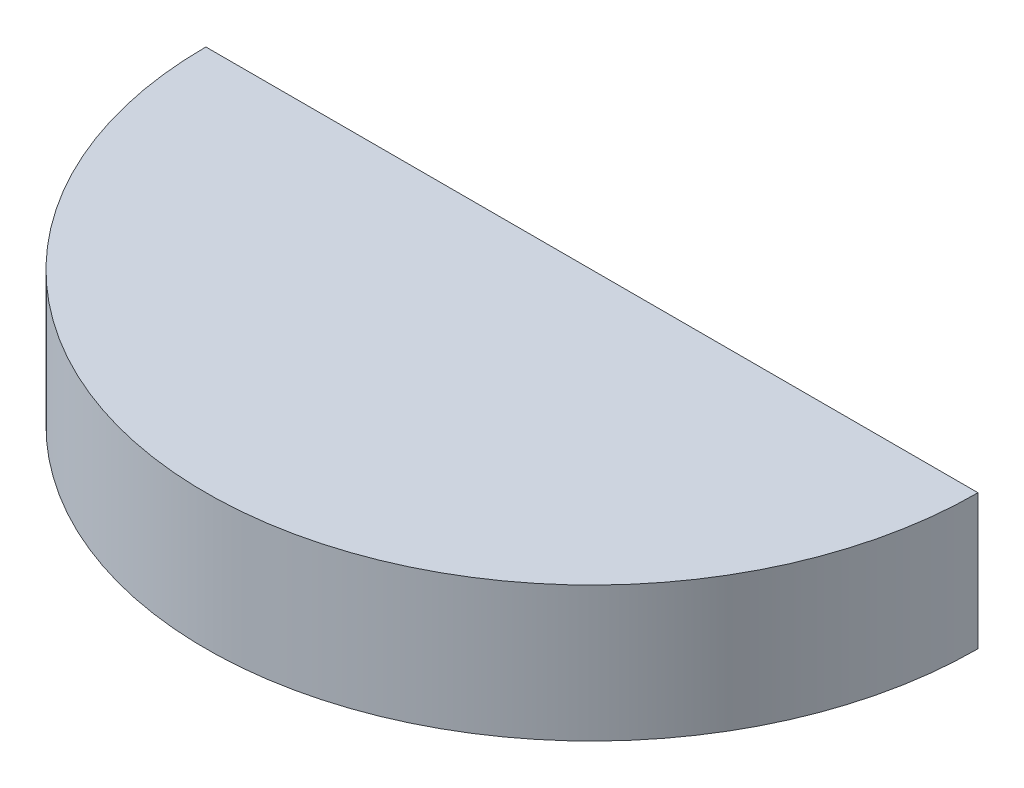
ISO-10303-21;
HEADER;
FILE_DESCRIPTION(('STEP AP214'),'2;1');
FILE_NAME('part.step','',(''),(''),'','','');
FILE_SCHEMA(('AUTOMOTIVE_DESIGN { 1 0 10303 214 1 1 1 1 }'));
ENDSEC;
DATA;
#1=APPLICATION_CONTEXT('core data for automotive mechanical design processes');
#2=APPLICATION_PROTOCOL_DEFINITION('international standard','automotive_design',2000,#1);
#3=PRODUCT_CONTEXT('',#1,'mechanical');
#4=PRODUCT('Part','Part','',(#3));
#5=PRODUCT_RELATED_PRODUCT_CATEGORY('part','',(#4));
#6=PRODUCT_DEFINITION_FORMATION('','',#4);
#7=PRODUCT_DEFINITION_CONTEXT('part definition',#1,'design');
#8=PRODUCT_DEFINITION('design','',#6,#7);
#9=PRODUCT_DEFINITION_SHAPE('','',#8);
#10=(LENGTH_UNIT() NAMED_UNIT(*) SI_UNIT(.MILLI.,.METRE.));
#11=(NAMED_UNIT(*) PLANE_ANGLE_UNIT() SI_UNIT($,.RADIAN.));
#12=(NAMED_UNIT(*) SI_UNIT($,.STERADIAN.) SOLID_ANGLE_UNIT());
#13=UNCERTAINTY_MEASURE_WITH_UNIT(LENGTH_MEASURE(1.E-05),#10,'distance_accuracy_value','');
#14=(GEOMETRIC_REPRESENTATION_CONTEXT(3) GLOBAL_UNCERTAINTY_ASSIGNED_CONTEXT((#13)) GLOBAL_UNIT_ASSIGNED_CONTEXT((#10,
#11,#12)) REPRESENTATION_CONTEXT('',''));
#15=CARTESIAN_POINT('',(0.,0.,0.));
#16=DIRECTION('',(0.,0.,1.));
#17=DIRECTION('',(1.,0.,0.));
#18=AXIS2_PLACEMENT_3D('',#15,#16,#17);
#19=CARTESIAN_POINT('',(-200.01,0.,200.01));
#20=DIRECTION('',(0.,-1.,0.));
#21=DIRECTION('',(0.,0.,-1.));
#22=AXIS2_PLACEMENT_3D('',#19,#20,#21);
#23=PLANE('',#22);
#24=DIRECTION('',(-1.,0.,0.));
#25=VECTOR('',#24,1.);
#26=CARTESIAN_POINT('',(0.,0.,0.));
#27=LINE('',#26,#25);
#28=CARTESIAN_POINT('',(200.,0.,0.));
#29=VERTEX_POINT('',#28);
#30=CARTESIAN_POINT('',(-200.,0.,0.));
#31=VERTEX_POINT('',#30);
#32=EDGE_CURVE('E40',#29,#31,#27,.T.);
#33=ORIENTED_EDGE('',*,*,#32,.F.);
#34=CARTESIAN_POINT('',(0.,0.,0.));
#35=DIRECTION('',(0.,-1.,0.));
#36=DIRECTION('',(1.,0.,0.));
#37=AXIS2_PLACEMENT_3D('',#34,#35,#36);
#38=CIRCLE('',#37,200.);
#39=EDGE_CURVE('E20',#31,#29,#38,.F.);
#40=ORIENTED_EDGE('',*,*,#39,.F.);
#41=EDGE_LOOP('',(#33,#40));
#42=FACE_BOUND('',#41,.T.);
#43=ADVANCED_FACE('F16',(#42),#23,.T.);
#44=CARTESIAN_POINT('',(200.01,-0.00999999999999891,0.));
#45=DIRECTION('',(0.,0.,-1.));
#46=DIRECTION('',(-1.,0.,0.));
#47=AXIS2_PLACEMENT_3D('',#44,#45,#46);
#48=PLANE('',#47);
#49=DIRECTION('',(-1.,0.,0.));
#50=VECTOR('',#49,1.);
#51=CARTESIAN_POINT('',(0.,70.0000000000001,0.));
#52=LINE('',#51,#50);
#53=CARTESIAN_POINT('',(200.,70.0000000000001,0.));
#54=VERTEX_POINT('',#53);
#55=CARTESIAN_POINT('',(-200.,70.,0.));
#56=VERTEX_POINT('',#55);
#57=EDGE_CURVE('E33',#54,#56,#52,.T.);
#58=ORIENTED_EDGE('',*,*,#57,.F.);
#59=DIRECTION('',(0.,1.,0.));
#60=VECTOR('',#59,1.);
#61=CARTESIAN_POINT('',(200.,35.0000000000001,0.));
#62=LINE('',#61,#60);
#63=EDGE_CURVE('E26',#29,#54,#62,.T.);
#64=ORIENTED_EDGE('',*,*,#63,.F.);
#65=ORIENTED_EDGE('',*,*,#32,.T.);
#66=DIRECTION('',(0.,-1.,0.));
#67=VECTOR('',#66,1.);
#68=CARTESIAN_POINT('',(-200.,35.,0.));
#69=LINE('',#68,#67);
#70=EDGE_CURVE('E44',#56,#31,#69,.T.);
#71=ORIENTED_EDGE('',*,*,#70,.F.);
#72=EDGE_LOOP('',(#58,#64,#65,#71));
#73=FACE_BOUND('',#72,.T.);
#74=ADVANCED_FACE('F42',(#73),#48,.T.);
#75=CARTESIAN_POINT('',(-200.01,70.,-0.0100000000000245));
#76=DIRECTION('',(0.,1.,0.));
#77=DIRECTION('',(0.,0.,1.));
#78=AXIS2_PLACEMENT_3D('',#75,#76,#77);
#79=PLANE('',#78);
#80=ORIENTED_EDGE('',*,*,#57,.T.);
#81=CARTESIAN_POINT('',(0.,70.,0.));
#82=DIRECTION('',(0.,-1.,0.));
#83=DIRECTION('',(1.,0.,0.));
#84=AXIS2_PLACEMENT_3D('',#81,#82,#83);
#85=CIRCLE('',#84,200.);
#86=EDGE_CURVE('E11',#54,#56,#85,.T.);
#87=ORIENTED_EDGE('',*,*,#86,.F.);
#88=EDGE_LOOP('',(#80,#87));
#89=FACE_BOUND('',#88,.T.);
#90=ADVANCED_FACE('F54',(#89),#79,.T.);
#91=CARTESIAN_POINT('',(0.,70.,0.));
#92=DIRECTION('',(0.,-1.,0.));
#93=DIRECTION('',(1.,0.,0.));
#94=AXIS2_PLACEMENT_3D('',#91,#92,#93);
#95=CYLINDRICAL_SURFACE('',#94,200.);
#96=ORIENTED_EDGE('',*,*,#63,.T.);
#97=ORIENTED_EDGE('',*,*,#86,.T.);
#98=ORIENTED_EDGE('',*,*,#70,.T.);
#99=ORIENTED_EDGE('',*,*,#39,.T.);
#100=EDGE_LOOP('',(#96,#97,#98,#99));
#101=FACE_BOUND('',#100,.T.);
#102=ADVANCED_FACE('F18',(#101),#95,.T.);
#103=CLOSED_SHELL('',(#43,#74,#90,#102));
#104=MANIFOLD_SOLID_BREP('B1',#103);
#105=ADVANCED_BREP_SHAPE_REPRESENTATION('',(#18,#104),#14);
#106=SHAPE_DEFINITION_REPRESENTATION(#9,#105);
ENDSEC;
END-ISO-10303-21;
